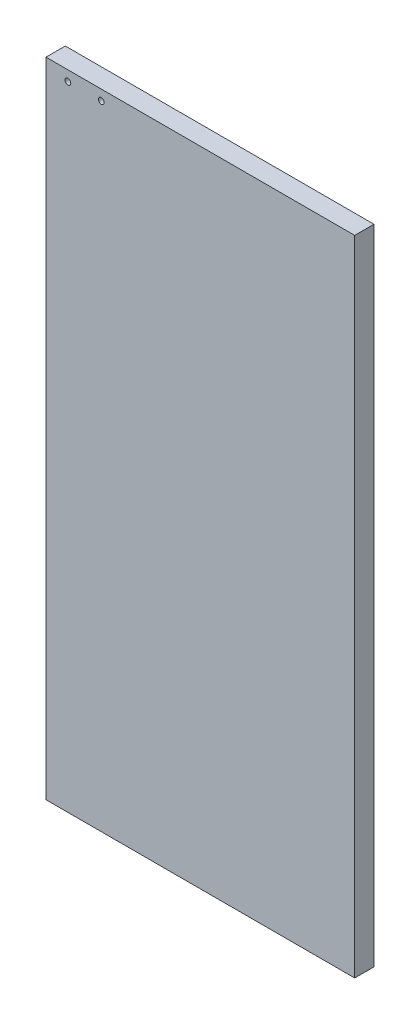
ISO-10303-21;
HEADER;
FILE_DESCRIPTION(('STEP AP214'),'2;1');
FILE_NAME('part.step','',(''),(''),'','','');
FILE_SCHEMA(('AUTOMOTIVE_DESIGN { 1 0 10303 214 1 1 1 1 }'));
ENDSEC;
DATA;
#1=APPLICATION_CONTEXT('core data for automotive mechanical design processes');
#2=APPLICATION_PROTOCOL_DEFINITION('international standard','automotive_design',2000,#1);
#3=PRODUCT_CONTEXT('',#1,'mechanical');
#4=PRODUCT('Part','Part','',(#3));
#5=PRODUCT_RELATED_PRODUCT_CATEGORY('part','',(#4));
#6=PRODUCT_DEFINITION_FORMATION('','',#4);
#7=PRODUCT_DEFINITION_CONTEXT('part definition',#1,'design');
#8=PRODUCT_DEFINITION('design','',#6,#7);
#9=PRODUCT_DEFINITION_SHAPE('','',#8);
#10=(LENGTH_UNIT() NAMED_UNIT(*) SI_UNIT(.MILLI.,.METRE.));
#11=(NAMED_UNIT(*) PLANE_ANGLE_UNIT() SI_UNIT($,.RADIAN.));
#12=(NAMED_UNIT(*) SI_UNIT($,.STERADIAN.) SOLID_ANGLE_UNIT());
#13=UNCERTAINTY_MEASURE_WITH_UNIT(LENGTH_MEASURE(1.E-05),#10,'distance_accuracy_value','');
#14=(GEOMETRIC_REPRESENTATION_CONTEXT(3) GLOBAL_UNCERTAINTY_ASSIGNED_CONTEXT((#13)) GLOBAL_UNIT_ASSIGNED_CONTEXT((#10,
#11,#12)) REPRESENTATION_CONTEXT('',''));
#15=CARTESIAN_POINT('',(0.,0.,0.));
#16=DIRECTION('',(0.,0.,1.));
#17=DIRECTION('',(1.,0.,0.));
#18=AXIS2_PLACEMENT_3D('',#15,#16,#17);
#19=CARTESIAN_POINT('',(0.,0.,15.));
#20=DIRECTION('',(1.,0.,0.));
#21=DIRECTION('',(0.,0.,-1.));
#22=AXIS2_PLACEMENT_3D('',#19,#20,#21);
#23=PLANE('',#22);
#24=DIRECTION('',(0.,-1.,0.));
#25=VECTOR('',#24,1.);
#26=CARTESIAN_POINT('',(0.,0.,0.));
#27=LINE('',#26,#25);
#28=CARTESIAN_POINT('',(0.,500.,0.));
#29=VERTEX_POINT('',#28);
#30=CARTESIAN_POINT('',(0.,0.,0.));
#31=VERTEX_POINT('',#30);
#32=EDGE_CURVE('E96',#29,#31,#27,.T.);
#33=ORIENTED_EDGE('',*,*,#32,.T.);
#34=DIRECTION('',(0.,0.,-1.));
#35=VECTOR('',#34,1.);
#36=CARTESIAN_POINT('',(0.,0.,15.));
#37=LINE('',#36,#35);
#38=CARTESIAN_POINT('',(0.,0.,15.));
#39=VERTEX_POINT('',#38);
#40=EDGE_CURVE('E11',#39,#31,#37,.T.);
#41=ORIENTED_EDGE('',*,*,#40,.F.);
#42=DIRECTION('',(0.,-1.,0.));
#43=VECTOR('',#42,1.);
#44=CARTESIAN_POINT('',(0.,0.,15.));
#45=LINE('',#44,#43);
#46=CARTESIAN_POINT('',(0.,500.,15.));
#47=VERTEX_POINT('',#46);
#48=EDGE_CURVE('E84',#47,#39,#45,.T.);
#49=ORIENTED_EDGE('',*,*,#48,.F.);
#50=DIRECTION('',(0.,0.,-1.));
#51=VECTOR('',#50,1.);
#52=CARTESIAN_POINT('',(0.,500.,15.));
#53=LINE('',#52,#51);
#54=EDGE_CURVE('E92',#47,#29,#53,.T.);
#55=ORIENTED_EDGE('',*,*,#54,.T.);
#56=EDGE_LOOP('',(#33,#41,#49,#55));
#57=FACE_BOUND('',#56,.T.);
#58=ADVANCED_FACE('F33',(#57),#23,.F.);
#59=CARTESIAN_POINT('',(0.,0.,15.));
#60=DIRECTION('',(0.,1.,0.));
#61=DIRECTION('',(0.,0.,1.));
#62=AXIS2_PLACEMENT_3D('',#59,#60,#61);
#63=PLANE('',#62);
#64=DIRECTION('',(1.,0.,0.));
#65=VECTOR('',#64,1.);
#66=CARTESIAN_POINT('',(0.,0.,0.));
#67=LINE('',#66,#65);
#68=CARTESIAN_POINT('',(240.,0.,0.));
#69=VERTEX_POINT('',#68);
#70=EDGE_CURVE('E88',#31,#69,#67,.T.);
#71=ORIENTED_EDGE('',*,*,#70,.T.);
#72=DIRECTION('',(0.,0.,-1.));
#73=VECTOR('',#72,1.);
#74=CARTESIAN_POINT('',(240.,0.,15.));
#75=LINE('',#74,#73);
#76=CARTESIAN_POINT('',(240.,0.,15.));
#77=VERTEX_POINT('',#76);
#78=EDGE_CURVE('E41',#77,#69,#75,.T.);
#79=ORIENTED_EDGE('',*,*,#78,.F.);
#80=DIRECTION('',(1.,0.,0.));
#81=VECTOR('',#80,1.);
#82=CARTESIAN_POINT('',(0.,0.,15.));
#83=LINE('',#82,#81);
#84=EDGE_CURVE('E79',#39,#77,#83,.T.);
#85=ORIENTED_EDGE('',*,*,#84,.F.);
#86=ORIENTED_EDGE('',*,*,#40,.T.);
#87=EDGE_LOOP('',(#71,#79,#85,#86));
#88=FACE_BOUND('',#87,.T.);
#89=ADVANCED_FACE('F87',(#88),#63,.F.);
#90=CARTESIAN_POINT('',(240.,0.,15.));
#91=DIRECTION('',(-1.,0.,0.));
#92=DIRECTION('',(0.,0.,1.));
#93=AXIS2_PLACEMENT_3D('',#90,#91,#92);
#94=PLANE('',#93);
#95=DIRECTION('',(0.,1.,0.));
#96=VECTOR('',#95,1.);
#97=CARTESIAN_POINT('',(240.,0.,0.));
#98=LINE('',#97,#96);
#99=CARTESIAN_POINT('',(240.,500.,0.));
#100=VERTEX_POINT('',#99);
#101=EDGE_CURVE('E66',#69,#100,#98,.T.);
#102=ORIENTED_EDGE('',*,*,#101,.T.);
#103=DIRECTION('',(0.,0.,-1.));
#104=VECTOR('',#103,1.);
#105=CARTESIAN_POINT('',(240.,500.,15.));
#106=LINE('',#105,#104);
#107=CARTESIAN_POINT('',(240.,500.,15.));
#108=VERTEX_POINT('',#107);
#109=EDGE_CURVE('E89',#108,#100,#106,.T.);
#110=ORIENTED_EDGE('',*,*,#109,.F.);
#111=DIRECTION('',(0.,1.,0.));
#112=VECTOR('',#111,1.);
#113=CARTESIAN_POINT('',(240.,0.,15.));
#114=LINE('',#113,#112);
#115=EDGE_CURVE('E82',#77,#108,#114,.T.);
#116=ORIENTED_EDGE('',*,*,#115,.F.);
#117=ORIENTED_EDGE('',*,*,#78,.T.);
#118=EDGE_LOOP('',(#102,#110,#116,#117));
#119=FACE_BOUND('',#118,.T.);
#120=ADVANCED_FACE('F90',(#119),#94,.F.);
#121=CARTESIAN_POINT('',(0.,500.,15.));
#122=DIRECTION('',(0.,-1.,0.));
#123=DIRECTION('',(0.,0.,-1.));
#124=AXIS2_PLACEMENT_3D('',#121,#122,#123);
#125=PLANE('',#124);
#126=DIRECTION('',(-1.,0.,0.));
#127=VECTOR('',#126,1.);
#128=CARTESIAN_POINT('',(0.,500.,0.));
#129=LINE('',#128,#127);
#130=EDGE_CURVE('E72',#100,#29,#129,.T.);
#131=ORIENTED_EDGE('',*,*,#130,.T.);
#132=ORIENTED_EDGE('',*,*,#54,.F.);
#133=DIRECTION('',(-1.,0.,0.));
#134=VECTOR('',#133,1.);
#135=CARTESIAN_POINT('',(0.,500.,15.));
#136=LINE('',#135,#134);
#137=EDGE_CURVE('E49',#108,#47,#136,.T.);
#138=ORIENTED_EDGE('',*,*,#137,.F.);
#139=ORIENTED_EDGE('',*,*,#109,.T.);
#140=EDGE_LOOP('',(#131,#132,#138,#139));
#141=FACE_BOUND('',#140,.T.);
#142=ADVANCED_FACE('F104',(#141),#125,.F.);
#143=CARTESIAN_POINT('',(0.,0.,15.));
#144=DIRECTION('',(0.,0.,-1.));
#145=DIRECTION('',(-1.,0.,0.));
#146=AXIS2_PLACEMENT_3D('',#143,#144,#145);
#147=PLANE('',#146);
#148=CARTESIAN_POINT('',(17.,492.,15.));
#149=DIRECTION('',(0.,0.,-1.));
#150=DIRECTION('',(-1.,0.,0.));
#151=AXIS2_PLACEMENT_3D('',#148,#149,#150);
#152=CIRCLE('',#151,2.25);
#153=CARTESIAN_POINT('',(14.75,492.,15.));
#154=VERTEX_POINT('',#153);
#155=EDGE_CURVE('E99',#154,#154,#152,.T.);
#156=ORIENTED_EDGE('',*,*,#155,.T.);
#157=EDGE_LOOP('',(#156));
#158=FACE_BOUND('',#157,.T.);
#159=CARTESIAN_POINT('',(43.,492.,15.));
#160=DIRECTION('',(0.,0.,-1.));
#161=DIRECTION('',(-1.,0.,0.));
#162=AXIS2_PLACEMENT_3D('',#159,#160,#161);
#163=CIRCLE('',#162,2.25);
#164=CARTESIAN_POINT('',(40.75,492.,15.));
#165=VERTEX_POINT('',#164);
#166=EDGE_CURVE('E112',#165,#165,#163,.T.);
#167=ORIENTED_EDGE('',*,*,#166,.T.);
#168=EDGE_LOOP('',(#167));
#169=FACE_BOUND('',#168,.T.);
#170=ORIENTED_EDGE('',*,*,#48,.T.);
#171=ORIENTED_EDGE('',*,*,#84,.T.);
#172=ORIENTED_EDGE('',*,*,#115,.T.);
#173=ORIENTED_EDGE('',*,*,#137,.T.);
#174=EDGE_LOOP('',(#170,#171,#172,#173));
#175=FACE_BOUND('',#174,.T.);
#176=ADVANCED_FACE('F80',(#158,#169,#175),#147,.F.);
#177=CARTESIAN_POINT('',(0.,0.,0.));
#178=DIRECTION('',(0.,0.,-1.));
#179=DIRECTION('',(-1.,0.,0.));
#180=AXIS2_PLACEMENT_3D('',#177,#178,#179);
#181=PLANE('',#180);
#182=CARTESIAN_POINT('',(17.,492.,0.));
#183=DIRECTION('',(0.,0.,1.));
#184=DIRECTION('',(1.,0.,0.));
#185=AXIS2_PLACEMENT_3D('',#182,#183,#184);
#186=CIRCLE('',#185,2.25);
#187=CARTESIAN_POINT('',(19.25,492.,0.));
#188=VERTEX_POINT('',#187);
#189=EDGE_CURVE('E115',#188,#188,#186,.T.);
#190=ORIENTED_EDGE('',*,*,#189,.T.);
#191=EDGE_LOOP('',(#190));
#192=FACE_BOUND('',#191,.T.);
#193=CARTESIAN_POINT('',(43.,492.,0.));
#194=DIRECTION('',(0.,0.,1.));
#195=DIRECTION('',(-1.,0.,0.));
#196=AXIS2_PLACEMENT_3D('',#193,#194,#195);
#197=CIRCLE('',#196,2.25);
#198=CARTESIAN_POINT('',(40.75,492.,0.));
#199=VERTEX_POINT('',#198);
#200=EDGE_CURVE('E116',#199,#199,#197,.T.);
#201=ORIENTED_EDGE('',*,*,#200,.T.);
#202=EDGE_LOOP('',(#201));
#203=FACE_BOUND('',#202,.T.);
#204=ORIENTED_EDGE('',*,*,#32,.F.);
#205=ORIENTED_EDGE('',*,*,#130,.F.);
#206=ORIENTED_EDGE('',*,*,#101,.F.);
#207=ORIENTED_EDGE('',*,*,#70,.F.);
#208=EDGE_LOOP('',(#204,#205,#206,#207));
#209=FACE_BOUND('',#208,.T.);
#210=ADVANCED_FACE('F107',(#192,#203,#209),#181,.T.);
#211=CARTESIAN_POINT('',(43.,492.,0.));
#212=DIRECTION('',(0.,0.,1.));
#213=DIRECTION('',(1.,0.,0.));
#214=AXIS2_PLACEMENT_3D('',#211,#212,#213);
#215=CYLINDRICAL_SURFACE('',#214,2.25);
#216=ORIENTED_EDGE('',*,*,#200,.F.);
#217=EDGE_LOOP('',(#216));
#218=FACE_BOUND('',#217,.T.);
#219=ORIENTED_EDGE('',*,*,#166,.F.);
#220=EDGE_LOOP('',(#219));
#221=FACE_BOUND('',#220,.T.);
#222=ADVANCED_FACE('F127',(#218,#221),#215,.F.);
#223=CARTESIAN_POINT('',(17.,492.,0.));
#224=DIRECTION('',(0.,0.,1.));
#225=DIRECTION('',(1.,0.,0.));
#226=AXIS2_PLACEMENT_3D('',#223,#224,#225);
#227=CYLINDRICAL_SURFACE('',#226,2.25);
#228=ORIENTED_EDGE('',*,*,#189,.F.);
#229=EDGE_LOOP('',(#228));
#230=FACE_BOUND('',#229,.T.);
#231=ORIENTED_EDGE('',*,*,#155,.F.);
#232=EDGE_LOOP('',(#231));
#233=FACE_BOUND('',#232,.T.);
#234=ADVANCED_FACE('F124',(#230,#233),#227,.F.);
#235=CLOSED_SHELL('',(#58,#89,#120,#142,#176,#210,#222,#234));
#236=MANIFOLD_SOLID_BREP('B2',#235);
#237=ADVANCED_BREP_SHAPE_REPRESENTATION('',(#18,#236),#14);
#238=SHAPE_DEFINITION_REPRESENTATION(#9,#237);
ENDSEC;
END-ISO-10303-21;
